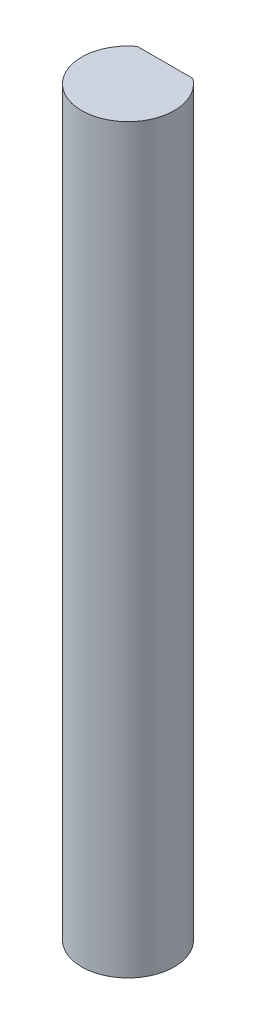
ISO-10303-21;
HEADER;
FILE_DESCRIPTION(('STEP AP214'),'2;1');
FILE_NAME('part.step','',(''),(''),'','','');
FILE_SCHEMA(('AUTOMOTIVE_DESIGN { 1 0 10303 214 1 1 1 1 }'));
ENDSEC;
DATA;
#1=APPLICATION_CONTEXT('core data for automotive mechanical design processes');
#2=APPLICATION_PROTOCOL_DEFINITION('international standard','automotive_design',2000,#1);
#3=PRODUCT_CONTEXT('',#1,'mechanical');
#4=PRODUCT('Part','Part','',(#3));
#5=PRODUCT_RELATED_PRODUCT_CATEGORY('part','',(#4));
#6=PRODUCT_DEFINITION_FORMATION('','',#4);
#7=PRODUCT_DEFINITION_CONTEXT('part definition',#1,'design');
#8=PRODUCT_DEFINITION('design','',#6,#7);
#9=PRODUCT_DEFINITION_SHAPE('','',#8);
#10=(LENGTH_UNIT() NAMED_UNIT(*) SI_UNIT(.MILLI.,.METRE.));
#11=(NAMED_UNIT(*) PLANE_ANGLE_UNIT() SI_UNIT($,.RADIAN.));
#12=(NAMED_UNIT(*) SI_UNIT($,.STERADIAN.) SOLID_ANGLE_UNIT());
#13=UNCERTAINTY_MEASURE_WITH_UNIT(LENGTH_MEASURE(1.E-05),#10,'distance_accuracy_value','');
#14=(GEOMETRIC_REPRESENTATION_CONTEXT(3) GLOBAL_UNCERTAINTY_ASSIGNED_CONTEXT((#13)) GLOBAL_UNIT_ASSIGNED_CONTEXT((#10,
#11,#12)) REPRESENTATION_CONTEXT('',''));
#15=CARTESIAN_POINT('',(0.,0.,0.));
#16=DIRECTION('',(0.,0.,1.));
#17=DIRECTION('',(1.,0.,0.));
#18=AXIS2_PLACEMENT_3D('',#15,#16,#17);
#19=CARTESIAN_POINT('',(0.,50.8,0.));
#20=DIRECTION('',(0.,-1.,0.));
#21=DIRECTION('',(0.,0.,-1.));
#22=AXIS2_PLACEMENT_3D('',#19,#20,#21);
#23=CYLINDRICAL_SURFACE('',#22,3.175);
#24=CARTESIAN_POINT('',(0.,50.8,0.));
#25=DIRECTION('',(0.,1.,0.));
#26=DIRECTION('',(0.,0.,1.));
#27=AXIS2_PLACEMENT_3D('',#24,#25,#26);
#28=CIRCLE('',#27,3.175);
#29=CARTESIAN_POINT('',(-1.905,50.8,-2.54));
#30=VERTEX_POINT('',#29);
#31=CARTESIAN_POINT('',(1.905,50.8,-2.54));
#32=VERTEX_POINT('',#31);
#33=EDGE_CURVE('E11',#30,#32,#28,.T.);
#34=ORIENTED_EDGE('',*,*,#33,.F.);
#35=DIRECTION('',(0.,-1.,0.));
#36=VECTOR('',#35,1.);
#37=CARTESIAN_POINT('',(-1.905,50.8,-2.54));
#38=LINE('',#37,#36);
#39=CARTESIAN_POINT('',(-1.905,0.,-2.54));
#40=VERTEX_POINT('',#39);
#41=EDGE_CURVE('E60',#30,#40,#38,.T.);
#42=ORIENTED_EDGE('',*,*,#41,.T.);
#43=CARTESIAN_POINT('',(0.,0.,0.));
#44=DIRECTION('',(0.,1.,0.));
#45=DIRECTION('',(0.,0.,1.));
#46=AXIS2_PLACEMENT_3D('',#43,#44,#45);
#47=CIRCLE('',#46,3.175);
#48=CARTESIAN_POINT('',(1.905,0.,-2.54));
#49=VERTEX_POINT('',#48);
#50=EDGE_CURVE('E42',#40,#49,#47,.T.);
#51=ORIENTED_EDGE('',*,*,#50,.T.);
#52=DIRECTION('',(0.,-1.,0.));
#53=VECTOR('',#52,1.);
#54=CARTESIAN_POINT('',(1.905,50.8,-2.54));
#55=LINE('',#54,#53);
#56=EDGE_CURVE('E54',#32,#49,#55,.T.);
#57=ORIENTED_EDGE('',*,*,#56,.F.);
#58=EDGE_LOOP('',(#34,#42,#51,#57));
#59=FACE_BOUND('',#58,.T.);
#60=ADVANCED_FACE('F39',(#59),#23,.T.);
#61=CARTESIAN_POINT('',(0.,50.8,0.));
#62=DIRECTION('',(0.,1.,0.));
#63=DIRECTION('',(0.,0.,1.));
#64=AXIS2_PLACEMENT_3D('',#61,#62,#63);
#65=PLANE('',#64);
#66=DIRECTION('',(-1.,0.,0.));
#67=VECTOR('',#66,1.);
#68=CARTESIAN_POINT('',(1.905,50.8,-2.54));
#69=LINE('',#68,#67);
#70=EDGE_CURVE('E70',#32,#30,#69,.T.);
#71=ORIENTED_EDGE('',*,*,#70,.T.);
#72=ORIENTED_EDGE('',*,*,#33,.T.);
#73=EDGE_LOOP('',(#71,#72));
#74=FACE_BOUND('',#73,.T.);
#75=ADVANCED_FACE('F83',(#74),#65,.T.);
#76=CARTESIAN_POINT('',(0.,0.,0.));
#77=DIRECTION('',(0.,1.,0.));
#78=DIRECTION('',(0.,0.,1.));
#79=AXIS2_PLACEMENT_3D('',#76,#77,#78);
#80=PLANE('',#79);
#81=ORIENTED_EDGE('',*,*,#50,.F.);
#82=DIRECTION('',(-1.,0.,0.));
#83=VECTOR('',#82,1.);
#84=CARTESIAN_POINT('',(1.905,0.,-2.54));
#85=LINE('',#84,#83);
#86=EDGE_CURVE('E64',#49,#40,#85,.T.);
#87=ORIENTED_EDGE('',*,*,#86,.F.);
#88=EDGE_LOOP('',(#81,#87));
#89=FACE_BOUND('',#88,.T.);
#90=ADVANCED_FACE('F76',(#89),#80,.F.);
#91=CARTESIAN_POINT('',(1.905,50.8,-2.54));
#92=DIRECTION('',(0.,0.,1.));
#93=DIRECTION('',(1.,0.,0.));
#94=AXIS2_PLACEMENT_3D('',#91,#92,#93);
#95=PLANE('',#94);
#96=ORIENTED_EDGE('',*,*,#86,.T.);
#97=ORIENTED_EDGE('',*,*,#41,.F.);
#98=ORIENTED_EDGE('',*,*,#70,.F.);
#99=ORIENTED_EDGE('',*,*,#56,.T.);
#100=EDGE_LOOP('',(#96,#97,#98,#99));
#101=FACE_BOUND('',#100,.T.);
#102=ADVANCED_FACE('F65',(#101),#95,.F.);
#103=CLOSED_SHELL('',(#60,#75,#90,#102));
#104=MANIFOLD_SOLID_BREP('B2',#103);
#105=ADVANCED_BREP_SHAPE_REPRESENTATION('',(#18,#104),#14);
#106=SHAPE_DEFINITION_REPRESENTATION(#9,#105);
ENDSEC;
END-ISO-10303-21;
